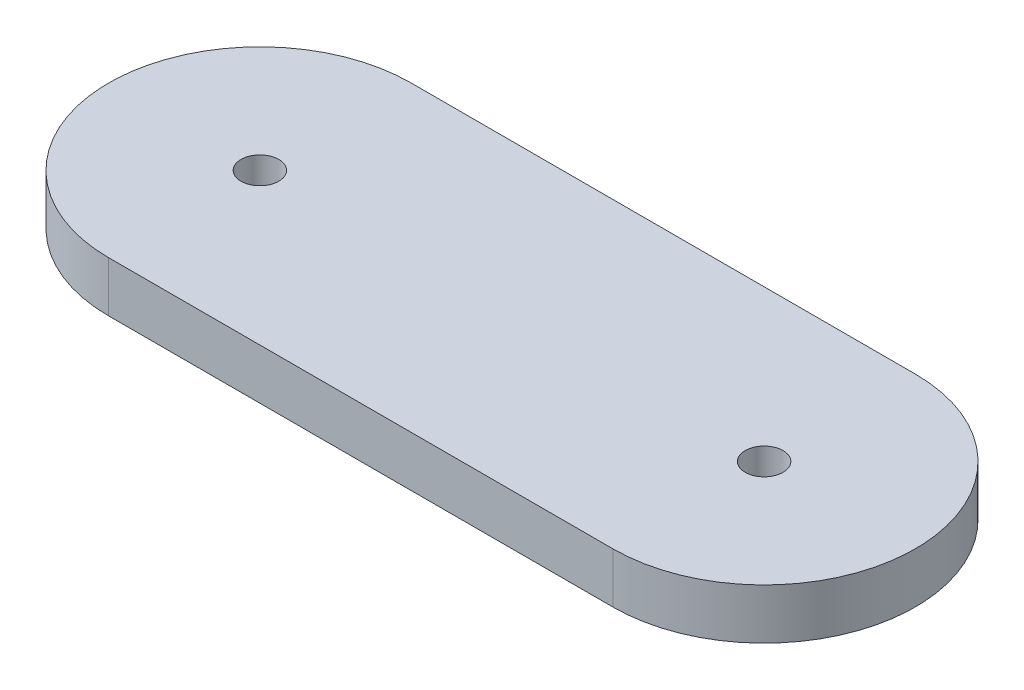
ISO-10303-21;
HEADER;
FILE_DESCRIPTION(('STEP AP214'),'2;1');
FILE_NAME('part.step','',(''),(''),'','','');
FILE_SCHEMA(('AUTOMOTIVE_DESIGN { 1 0 10303 214 1 1 1 1 }'));
ENDSEC;
DATA;
#1=APPLICATION_CONTEXT('core data for automotive mechanical design processes');
#2=APPLICATION_PROTOCOL_DEFINITION('international standard','automotive_design',2000,#1);
#3=PRODUCT_CONTEXT('',#1,'mechanical');
#4=PRODUCT('Part','Part','',(#3));
#5=PRODUCT_RELATED_PRODUCT_CATEGORY('part','',(#4));
#6=PRODUCT_DEFINITION_FORMATION('','',#4);
#7=PRODUCT_DEFINITION_CONTEXT('part definition',#1,'design');
#8=PRODUCT_DEFINITION('design','',#6,#7);
#9=PRODUCT_DEFINITION_SHAPE('','',#8);
#10=(LENGTH_UNIT() NAMED_UNIT(*) SI_UNIT(.MILLI.,.METRE.));
#11=(NAMED_UNIT(*) PLANE_ANGLE_UNIT() SI_UNIT($,.RADIAN.));
#12=(NAMED_UNIT(*) SI_UNIT($,.STERADIAN.) SOLID_ANGLE_UNIT());
#13=UNCERTAINTY_MEASURE_WITH_UNIT(LENGTH_MEASURE(1.E-05),#10,'distance_accuracy_value','');
#14=(GEOMETRIC_REPRESENTATION_CONTEXT(3) GLOBAL_UNCERTAINTY_ASSIGNED_CONTEXT((#13)) GLOBAL_UNIT_ASSIGNED_CONTEXT((#10,
#11,#12)) REPRESENTATION_CONTEXT('',''));
#15=CARTESIAN_POINT('',(0.,0.,0.));
#16=DIRECTION('',(0.,0.,1.));
#17=DIRECTION('',(1.,0.,0.));
#18=AXIS2_PLACEMENT_3D('',#15,#16,#17);
#19=CARTESIAN_POINT('',(-66.9126650970025,12.7,0.));
#20=DIRECTION('',(0.,-1.,0.));
#21=DIRECTION('',(0.,0.,-1.));
#22=AXIS2_PLACEMENT_3D('',#19,#20,#21);
#23=CYLINDRICAL_SURFACE('',#22,38.1);
#24=DIRECTION('',(0.,-1.,0.));
#25=VECTOR('',#24,1.);
#26=CARTESIAN_POINT('',(-66.9126650970025,12.7,38.1));
#27=LINE('',#26,#25);
#28=CARTESIAN_POINT('',(-66.9126650970025,12.7,38.1));
#29=VERTEX_POINT('',#28);
#30=CARTESIAN_POINT('',(-66.9126650970025,0.,38.1));
#31=VERTEX_POINT('',#30);
#32=EDGE_CURVE('E12',#29,#31,#27,.T.);
#33=ORIENTED_EDGE('',*,*,#32,.F.);
#34=CARTESIAN_POINT('',(-66.9126650970025,12.7,0.));
#35=DIRECTION('',(0.,1.,0.));
#36=DIRECTION('',(0.,0.,1.));
#37=AXIS2_PLACEMENT_3D('',#34,#35,#36);
#38=CIRCLE('',#37,38.1);
#39=CARTESIAN_POINT('',(-66.9126650970025,12.7,-38.1));
#40=VERTEX_POINT('',#39);
#41=EDGE_CURVE('E146',#40,#29,#38,.T.);
#42=ORIENTED_EDGE('',*,*,#41,.F.);
#43=DIRECTION('',(0.,-1.,0.));
#44=VECTOR('',#43,1.);
#45=CARTESIAN_POINT('',(-66.9126650970025,12.7,-38.1));
#46=LINE('',#45,#44);
#47=CARTESIAN_POINT('',(-66.9126650970025,0.,-38.1));
#48=VERTEX_POINT('',#47);
#49=EDGE_CURVE('E90',#40,#48,#46,.T.);
#50=ORIENTED_EDGE('',*,*,#49,.T.);
#51=CARTESIAN_POINT('',(-66.9126650970025,0.,0.));
#52=DIRECTION('',(0.,1.,0.));
#53=DIRECTION('',(0.,0.,1.));
#54=AXIS2_PLACEMENT_3D('',#51,#52,#53);
#55=CIRCLE('',#54,38.1);
#56=EDGE_CURVE('E135',#48,#31,#55,.T.);
#57=ORIENTED_EDGE('',*,*,#56,.T.);
#58=EDGE_LOOP('',(#33,#42,#50,#57));
#59=FACE_BOUND('',#58,.T.);
#60=ADVANCED_FACE('F78',(#59),#23,.T.);
#61=CARTESIAN_POINT('',(-66.9126650970025,0.,0.));
#62=DIRECTION('',(0.,1.,0.));
#63=DIRECTION('',(0.,0.,1.));
#64=AXIS2_PLACEMENT_3D('',#61,#62,#63);
#65=PLANE('',#64);
#66=CARTESIAN_POINT('',(-66.9126650970025,0.,0.));
#67=DIRECTION('',(0.,1.,0.));
#68=DIRECTION('',(0.,0.,1.));
#69=AXIS2_PLACEMENT_3D('',#66,#67,#68);
#70=CIRCLE('',#69,4.7625);
#71=CARTESIAN_POINT('',(-66.9126650970025,0.,4.7625));
#72=VERTEX_POINT('',#71);
#73=EDGE_CURVE('E128',#72,#72,#70,.T.);
#74=ORIENTED_EDGE('',*,*,#73,.T.);
#75=EDGE_LOOP('',(#74));
#76=FACE_BOUND('',#75,.T.);
#77=CARTESIAN_POINT('',(60.0873349029975,0.,0.));
#78=DIRECTION('',(0.,1.,0.));
#79=DIRECTION('',(0.,0.,1.));
#80=AXIS2_PLACEMENT_3D('',#77,#78,#79);
#81=CIRCLE('',#80,4.76249999999999);
#82=CARTESIAN_POINT('',(60.0873349029975,0.,4.76249999999999));
#83=VERTEX_POINT('',#82);
#84=EDGE_CURVE('E160',#83,#83,#81,.T.);
#85=ORIENTED_EDGE('',*,*,#84,.T.);
#86=EDGE_LOOP('',(#85));
#87=FACE_BOUND('',#86,.T.);
#88=ORIENTED_EDGE('',*,*,#56,.F.);
#89=DIRECTION('',(1.,0.,0.));
#90=VECTOR('',#89,1.);
#91=CARTESIAN_POINT('',(-66.9126650970025,0.,-38.1));
#92=LINE('',#91,#90);
#93=CARTESIAN_POINT('',(60.0873349029975,0.,-38.1));
#94=VERTEX_POINT('',#93);
#95=EDGE_CURVE('E122',#48,#94,#92,.T.);
#96=ORIENTED_EDGE('',*,*,#95,.T.);
#97=CARTESIAN_POINT('',(60.0873349029975,0.,0.));
#98=DIRECTION('',(0.,1.,0.));
#99=DIRECTION('',(0.,0.,1.));
#100=AXIS2_PLACEMENT_3D('',#97,#98,#99);
#101=CIRCLE('',#100,38.1);
#102=CARTESIAN_POINT('',(60.0873349029975,0.,38.1));
#103=VERTEX_POINT('',#102);
#104=EDGE_CURVE('E85',#103,#94,#101,.T.);
#105=ORIENTED_EDGE('',*,*,#104,.F.);
#106=DIRECTION('',(1.,0.,0.));
#107=VECTOR('',#106,1.);
#108=CARTESIAN_POINT('',(-66.9126650970025,0.,38.1));
#109=LINE('',#108,#107);
#110=EDGE_CURVE('E132',#31,#103,#109,.T.);
#111=ORIENTED_EDGE('',*,*,#110,.F.);
#112=EDGE_LOOP('',(#88,#96,#105,#111));
#113=FACE_BOUND('',#112,.T.);
#114=ADVANCED_FACE('F134',(#76,#87,#113),#65,.F.);
#115=CARTESIAN_POINT('',(-66.9126650970025,12.7,0.));
#116=DIRECTION('',(0.,1.,0.));
#117=DIRECTION('',(0.,0.,1.));
#118=AXIS2_PLACEMENT_3D('',#115,#116,#117);
#119=PLANE('',#118);
#120=CARTESIAN_POINT('',(-66.9126650970025,12.7,0.));
#121=DIRECTION('',(0.,1.,0.));
#122=DIRECTION('',(0.,0.,1.));
#123=AXIS2_PLACEMENT_3D('',#120,#121,#122);
#124=CIRCLE('',#123,4.7625);
#125=CARTESIAN_POINT('',(-66.9126650970025,12.7,4.7625));
#126=VERTEX_POINT('',#125);
#127=EDGE_CURVE('E162',#126,#126,#124,.T.);
#128=ORIENTED_EDGE('',*,*,#127,.F.);
#129=EDGE_LOOP('',(#128));
#130=FACE_BOUND('',#129,.T.);
#131=CARTESIAN_POINT('',(60.0873349029975,12.7,0.));
#132=DIRECTION('',(0.,1.,0.));
#133=DIRECTION('',(0.,0.,1.));
#134=AXIS2_PLACEMENT_3D('',#131,#132,#133);
#135=CIRCLE('',#134,4.76249999999999);
#136=CARTESIAN_POINT('',(60.0873349029975,12.7,4.76249999999999));
#137=VERTEX_POINT('',#136);
#138=EDGE_CURVE('E159',#137,#137,#135,.T.);
#139=ORIENTED_EDGE('',*,*,#138,.F.);
#140=EDGE_LOOP('',(#139));
#141=FACE_BOUND('',#140,.T.);
#142=ORIENTED_EDGE('',*,*,#41,.T.);
#143=DIRECTION('',(1.,0.,0.));
#144=VECTOR('',#143,1.);
#145=CARTESIAN_POINT('',(-66.9126650970025,12.7,38.1));
#146=LINE('',#145,#144);
#147=CARTESIAN_POINT('',(60.0873349029975,12.7,38.1));
#148=VERTEX_POINT('',#147);
#149=EDGE_CURVE('E133',#29,#148,#146,.T.);
#150=ORIENTED_EDGE('',*,*,#149,.T.);
#151=CARTESIAN_POINT('',(60.0873349029975,12.7,0.));
#152=DIRECTION('',(0.,1.,0.));
#153=DIRECTION('',(0.,0.,1.));
#154=AXIS2_PLACEMENT_3D('',#151,#152,#153);
#155=CIRCLE('',#154,38.1);
#156=CARTESIAN_POINT('',(60.0873349029975,12.7,-38.1));
#157=VERTEX_POINT('',#156);
#158=EDGE_CURVE('E129',#148,#157,#155,.T.);
#159=ORIENTED_EDGE('',*,*,#158,.T.);
#160=DIRECTION('',(1.,0.,0.));
#161=VECTOR('',#160,1.);
#162=CARTESIAN_POINT('',(-66.9126650970025,12.7,-38.1));
#163=LINE('',#162,#161);
#164=EDGE_CURVE('E125',#40,#157,#163,.T.);
#165=ORIENTED_EDGE('',*,*,#164,.F.);
#166=EDGE_LOOP('',(#142,#150,#159,#165));
#167=FACE_BOUND('',#166,.T.);
#168=ADVANCED_FACE('F144',(#130,#141,#167),#119,.T.);
#169=CARTESIAN_POINT('',(60.0873349029975,12.7,0.));
#170=DIRECTION('',(0.,-1.,0.));
#171=DIRECTION('',(0.,0.,-1.));
#172=AXIS2_PLACEMENT_3D('',#169,#170,#171);
#173=CYLINDRICAL_SURFACE('',#172,38.1);
#174=DIRECTION('',(0.,-1.,0.));
#175=VECTOR('',#174,1.);
#176=CARTESIAN_POINT('',(60.0873349029975,12.7,38.1));
#177=LINE('',#176,#175);
#178=EDGE_CURVE('E113',#148,#103,#177,.T.);
#179=ORIENTED_EDGE('',*,*,#178,.T.);
#180=ORIENTED_EDGE('',*,*,#104,.T.);
#181=DIRECTION('',(0.,-1.,0.));
#182=VECTOR('',#181,1.);
#183=CARTESIAN_POINT('',(60.0873349029975,12.7,-38.1));
#184=LINE('',#183,#182);
#185=EDGE_CURVE('E120',#157,#94,#184,.T.);
#186=ORIENTED_EDGE('',*,*,#185,.F.);
#187=ORIENTED_EDGE('',*,*,#158,.F.);
#188=EDGE_LOOP('',(#179,#180,#186,#187));
#189=FACE_BOUND('',#188,.T.);
#190=ADVANCED_FACE('F82',(#189),#173,.T.);
#191=CARTESIAN_POINT('',(-66.9126650970025,12.7,-38.1));
#192=DIRECTION('',(0.,0.,-1.));
#193=DIRECTION('',(-1.,0.,0.));
#194=AXIS2_PLACEMENT_3D('',#191,#192,#193);
#195=PLANE('',#194);
#196=ORIENTED_EDGE('',*,*,#95,.F.);
#197=ORIENTED_EDGE('',*,*,#49,.F.);
#198=ORIENTED_EDGE('',*,*,#164,.T.);
#199=ORIENTED_EDGE('',*,*,#185,.T.);
#200=EDGE_LOOP('',(#196,#197,#198,#199));
#201=FACE_BOUND('',#200,.T.);
#202=ADVANCED_FACE('F118',(#201),#195,.T.);
#203=CARTESIAN_POINT('',(-66.9126650970025,12.7,38.1));
#204=DIRECTION('',(0.,0.,-1.));
#205=DIRECTION('',(-1.,0.,0.));
#206=AXIS2_PLACEMENT_3D('',#203,#204,#205);
#207=PLANE('',#206);
#208=ORIENTED_EDGE('',*,*,#110,.T.);
#209=ORIENTED_EDGE('',*,*,#178,.F.);
#210=ORIENTED_EDGE('',*,*,#149,.F.);
#211=ORIENTED_EDGE('',*,*,#32,.T.);
#212=EDGE_LOOP('',(#208,#209,#210,#211));
#213=FACE_BOUND('',#212,.T.);
#214=ADVANCED_FACE('F147',(#213),#207,.F.);
#215=CARTESIAN_POINT('',(60.0873349029975,0.,0.));
#216=DIRECTION('',(0.,1.,0.));
#217=DIRECTION('',(0.,0.,1.));
#218=AXIS2_PLACEMENT_3D('',#215,#216,#217);
#219=CYLINDRICAL_SURFACE('',#218,4.76249999999999);
#220=ORIENTED_EDGE('',*,*,#84,.F.);
#221=EDGE_LOOP('',(#220));
#222=FACE_BOUND('',#221,.T.);
#223=ORIENTED_EDGE('',*,*,#138,.T.);
#224=EDGE_LOOP('',(#223));
#225=FACE_BOUND('',#224,.T.);
#226=ADVANCED_FACE('F173',(#222,#225),#219,.F.);
#227=CARTESIAN_POINT('',(-66.9126650970025,0.,0.));
#228=DIRECTION('',(0.,1.,0.));
#229=DIRECTION('',(0.,0.,1.));
#230=AXIS2_PLACEMENT_3D('',#227,#228,#229);
#231=CYLINDRICAL_SURFACE('',#230,4.7625);
#232=ORIENTED_EDGE('',*,*,#73,.F.);
#233=EDGE_LOOP('',(#232));
#234=FACE_BOUND('',#233,.T.);
#235=ORIENTED_EDGE('',*,*,#127,.T.);
#236=EDGE_LOOP('',(#235));
#237=FACE_BOUND('',#236,.T.);
#238=ADVANCED_FACE('F174',(#234,#237),#231,.F.);
#239=CLOSED_SHELL('',(#60,#114,#168,#190,#202,#214,#226,#238));
#240=MANIFOLD_SOLID_BREP('B2',#239);
#241=ADVANCED_BREP_SHAPE_REPRESENTATION('',(#18,#240),#14);
#242=SHAPE_DEFINITION_REPRESENTATION(#9,#241);
ENDSEC;
END-ISO-10303-21;
